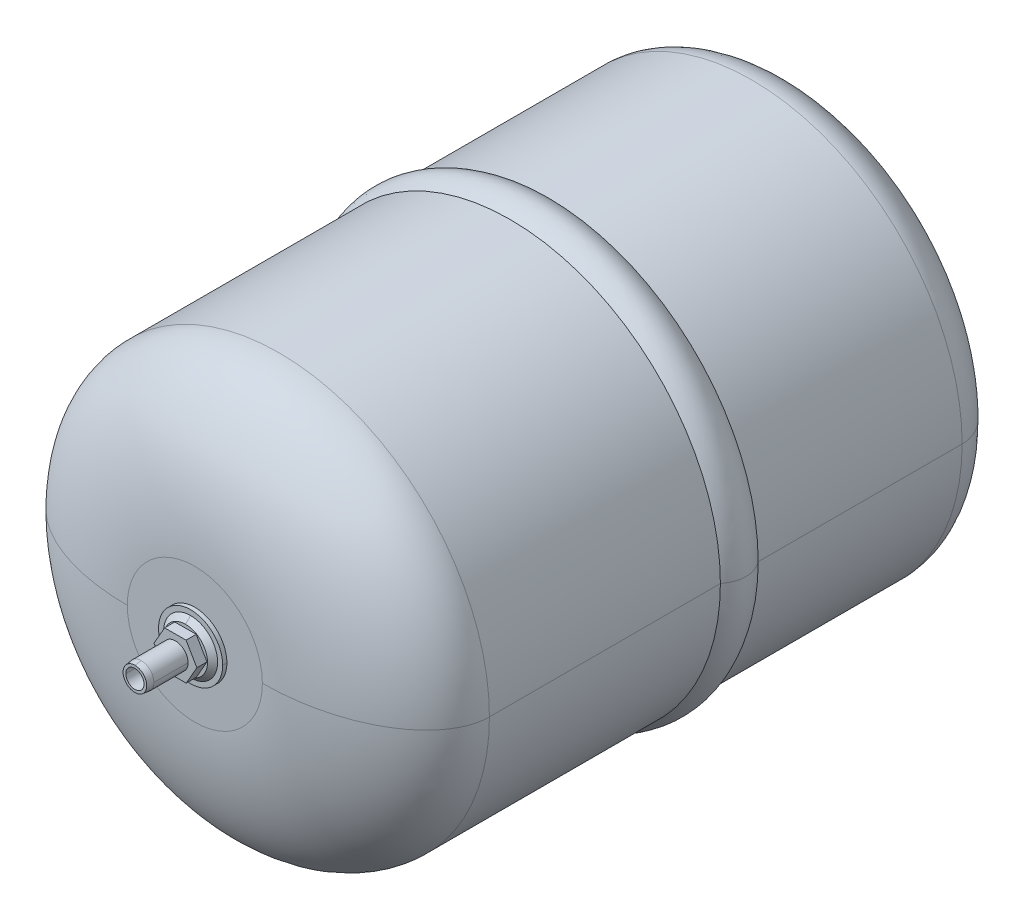
ISO-10303-21;
HEADER;
FILE_DESCRIPTION(('STEP AP214'),'2;1');
FILE_NAME('part.step','',(''),(''),'','','');
FILE_SCHEMA(('AUTOMOTIVE_DESIGN { 1 0 10303 214 1 1 1 1 }'));
ENDSEC;
DATA;
#1=APPLICATION_CONTEXT('core data for automotive mechanical design processes');
#2=APPLICATION_PROTOCOL_DEFINITION('international standard','automotive_design',2000,#1);
#3=PRODUCT_CONTEXT('',#1,'mechanical');
#4=PRODUCT('Part','Part','',(#3));
#5=PRODUCT_RELATED_PRODUCT_CATEGORY('part','',(#4));
#6=PRODUCT_DEFINITION_FORMATION('','',#4);
#7=PRODUCT_DEFINITION_CONTEXT('part definition',#1,'design');
#8=PRODUCT_DEFINITION('design','',#6,#7);
#9=PRODUCT_DEFINITION_SHAPE('','',#8);
#10=(LENGTH_UNIT() NAMED_UNIT(*) SI_UNIT(.MILLI.,.METRE.));
#11=(NAMED_UNIT(*) PLANE_ANGLE_UNIT() SI_UNIT($,.RADIAN.));
#12=(NAMED_UNIT(*) SI_UNIT($,.STERADIAN.) SOLID_ANGLE_UNIT());
#13=UNCERTAINTY_MEASURE_WITH_UNIT(LENGTH_MEASURE(1.E-05),#10,'distance_accuracy_value','');
#14=(GEOMETRIC_REPRESENTATION_CONTEXT(3) GLOBAL_UNCERTAINTY_ASSIGNED_CONTEXT((#13)) GLOBAL_UNIT_ASSIGNED_CONTEXT((#10,
#11,#12)) REPRESENTATION_CONTEXT('',''));
#15=CARTESIAN_POINT('',(0.,0.,0.));
#16=DIRECTION('',(0.,0.,1.));
#17=DIRECTION('',(1.,0.,0.));
#18=AXIS2_PLACEMENT_3D('',#15,#16,#17);
#19=CARTESIAN_POINT('',(146.227750069882,64.5053159670911,106.890113648807));
#20=CARTESIAN_POINT('',(146.227750069882,64.5053159670911,113.420210522901));
#21=CARTESIAN_POINT('',(154.978011575014,64.5053159670911,126.712444119144));
#22=CARTESIAN_POINT('',(177.441886352664,64.505315967091,131.890113648807));
#23=CARTESIAN_POINT('',(188.477750069882,64.505315967091,131.890113648807));
#24=(BOUNDED_CURVE() B_SPLINE_CURVE(3,(#19,#20,#21,#22,#23),.UNSPECIFIED.,.F.,
.F.) B_SPLINE_CURVE_WITH_KNOTS((4,1,4),(0.371184601024353,0.785398163397448,1.19961172577054),
.UNSPECIFIED.) CURVE() GEOMETRIC_REPRESENTATION_ITEM() RATIONAL_B_SPLINE_CURVE((1.17157287525381,
1.05719095841794,0.942809041582063,1.05719095841794,1.17157287525381)) REPRESENTATION_ITEM(''));
#25=CARTESIAN_POINT('',(208.477750069882,64.5053159670909,106.890113648807));
#26=DIRECTION('',(0.,0.,-1.));
#27=AXIS1_PLACEMENT('',#25,#26);
#28=SURFACE_OF_REVOLUTION('',#24,#27);
#29=CARTESIAN_POINT('',(188.477750069882,64.505315967091,106.890113648807));
#30=DIRECTION('',(0.,-1.,0.));
#31=DIRECTION('',(-1.,0.,0.));
#32=AXIS2_PLACEMENT_3D('',#29,#30,#31);
#33=ELLIPSE('',#32,42.25,25.);
#34=CARTESIAN_POINT('',(188.477750069882,64.505315967091,131.890113648807));
#35=VERTEX_POINT('',#34);
#36=CARTESIAN_POINT('',(146.227750069882,64.5053159670909,106.890113648807));
#37=VERTEX_POINT('',#36);
#38=EDGE_CURVE('E65',#35,#37,#33,.T.);
#39=ORIENTED_EDGE('',*,*,#38,.F.);
#40=CARTESIAN_POINT('',(208.477750069882,64.5053159670909,131.890113648807));
#41=DIRECTION('',(0.,0.,-1.));
#42=DIRECTION('',(-1.,0.,0.));
#43=AXIS2_PLACEMENT_3D('',#40,#41,#42);
#44=CIRCLE('',#43,20.);
#45=CARTESIAN_POINT('',(228.477750069882,64.5053159670909,131.890113648807));
#46=VERTEX_POINT('',#45);
#47=EDGE_CURVE('E11',#35,#46,#44,.T.);
#48=ORIENTED_EDGE('',*,*,#47,.T.);
#49=CARTESIAN_POINT('',(228.477750069882,64.5053159670909,106.890113648807));
#50=DIRECTION('',(0.,1.,0.));
#51=DIRECTION('',(1.,0.,0.));
#52=AXIS2_PLACEMENT_3D('',#49,#50,#51);
#53=ELLIPSE('',#52,42.25,25.);
#54=CARTESIAN_POINT('',(270.727750069882,64.5053159670909,106.890113648807));
#55=VERTEX_POINT('',#54);
#56=EDGE_CURVE('E57',#46,#55,#53,.T.);
#57=ORIENTED_EDGE('',*,*,#56,.T.);
#58=CARTESIAN_POINT('',(208.477750069882,64.5053159670909,106.890113648807));
#59=DIRECTION('',(0.,0.,-1.));
#60=DIRECTION('',(1.,0.,0.));
#61=AXIS2_PLACEMENT_3D('',#58,#59,#60);
#62=CIRCLE('',#61,62.25);
#63=EDGE_CURVE('E236',#37,#55,#62,.T.);
#64=ORIENTED_EDGE('',*,*,#63,.F.);
#65=EDGE_LOOP('',(#39,#48,#57,#64));
#66=FACE_BOUND('',#65,.T.);
#67=ADVANCED_FACE('F44',(#66),#28,.F.);
#68=CARTESIAN_POINT('',(146.227750069882,64.5053159670911,-33.1098863511925));
#69=CARTESIAN_POINT('',(146.227750069882,64.5053159670911,-37.2891483506124));
#70=CARTESIAN_POINT('',(151.353642904249,64.5053159670911,-45.7961778522077));
#71=CARTESIAN_POINT('',(164.512954164529,64.5053159670911,-49.1098863511925));
#72=CARTESIAN_POINT('',(170.977750069882,64.5053159670911,-49.1098863511925));
#73=(BOUNDED_CURVE() B_SPLINE_CURVE(3,(#68,#69,#70,#71,#72),.UNSPECIFIED.,.F.,
.F.) B_SPLINE_CURVE_WITH_KNOTS((4,1,4),(0.371184601024353,0.785398163397448,1.19961172577054),
.UNSPECIFIED.) CURVE() GEOMETRIC_REPRESENTATION_ITEM() RATIONAL_B_SPLINE_CURVE((1.17157287525381,
1.05719095841794,0.942809041582063,1.05719095841794,1.17157287525381)) REPRESENTATION_ITEM(''));
#74=CARTESIAN_POINT('',(208.477750069882,64.5053159670909,-33.1098863511925));
#75=DIRECTION('',(0.,0.,1.));
#76=AXIS1_PLACEMENT('',#74,#75);
#77=SURFACE_OF_REVOLUTION('',#73,#76);
#78=CARTESIAN_POINT('',(170.977750069882,64.5053159670911,-33.1098863511925));
#79=DIRECTION('',(0.,1.,0.));
#80=DIRECTION('',(-1.,0.,0.));
#81=AXIS2_PLACEMENT_3D('',#78,#79,#80);
#82=ELLIPSE('',#81,24.75,16.);
#83=CARTESIAN_POINT('',(170.977750069882,64.5053159670911,-49.1098863511925));
#84=VERTEX_POINT('',#83);
#85=CARTESIAN_POINT('',(146.227750069882,64.5053159670909,-33.1098863511925));
#86=VERTEX_POINT('',#85);
#87=EDGE_CURVE('E208',#84,#86,#82,.T.);
#88=ORIENTED_EDGE('',*,*,#87,.F.);
#89=CARTESIAN_POINT('',(208.477750069882,64.5053159670909,-49.1098863511925));
#90=DIRECTION('',(0.,0.,1.));
#91=DIRECTION('',(-1.,0.,0.));
#92=AXIS2_PLACEMENT_3D('',#89,#90,#91);
#93=CIRCLE('',#92,37.5);
#94=CARTESIAN_POINT('',(245.977750069882,64.5053159670908,-49.1098863511925));
#95=VERTEX_POINT('',#94);
#96=EDGE_CURVE('E260',#84,#95,#93,.T.);
#97=ORIENTED_EDGE('',*,*,#96,.T.);
#98=CARTESIAN_POINT('',(245.977750069882,64.5053159670908,-33.1098863511925));
#99=DIRECTION('',(0.,-1.,0.));
#100=DIRECTION('',(1.,0.,0.));
#101=AXIS2_PLACEMENT_3D('',#98,#99,#100);
#102=ELLIPSE('',#101,24.75,16.);
#103=CARTESIAN_POINT('',(270.727750069882,64.5053159670909,-33.1098863511925));
#104=VERTEX_POINT('',#103);
#105=EDGE_CURVE('E222',#95,#104,#102,.T.);
#106=ORIENTED_EDGE('',*,*,#105,.T.);
#107=CARTESIAN_POINT('',(208.477750069882,64.5053159670909,-33.1098863511925));
#108=DIRECTION('',(0.,0.,1.));
#109=DIRECTION('',(1.,0.,0.));
#110=AXIS2_PLACEMENT_3D('',#107,#108,#109);
#111=CIRCLE('',#110,62.25);
#112=EDGE_CURVE('E218',#86,#104,#111,.T.);
#113=ORIENTED_EDGE('',*,*,#112,.F.);
#114=EDGE_LOOP('',(#88,#97,#106,#113));
#115=FACE_BOUND('',#114,.T.);
#116=ADVANCED_FACE('F221',(#115),#77,.F.);
#117=CARTESIAN_POINT('',(146.227750069882,64.5053159670911,38.4852504260056));
#118=CARTESIAN_POINT('',(144.913464355596,64.5053159670911,36.7267788674577));
#119=CARTESIAN_POINT('',(143.521867716941,64.5053159670911,32.8901136488075));
#120=CARTESIAN_POINT('',(144.913464355596,64.5053159670911,29.0534484301573));
#121=CARTESIAN_POINT('',(146.227750069882,64.5053159670911,27.2949768716093));
#122=(BOUNDED_CURVE() B_SPLINE_CURVE(3,(#117,#118,#119,#120,#121),.UNSPECIFIED.,.F.,
.F.) B_SPLINE_CURVE_WITH_KNOTS((4,1,4),(-6.49169972123666,-6.28318530717959,-6.07467089312251),
.UNSPECIFIED.) CURVE() GEOMETRIC_REPRESENTATION_ITEM() RATIONAL_B_SPLINE_CURVE((1.04347826086956,
1.01449275362319,0.985507246376812,1.01449275362319,1.04347826086956)) REPRESENTATION_ITEM(''));
#123=CARTESIAN_POINT('',(208.477750069882,64.5053159670909,38.4852504260056));
#124=DIRECTION('',(0.,0.,1.));
#125=AXIS1_PLACEMENT('',#123,#124);
#126=SURFACE_OF_REVOLUTION('',#122,#125);
#127=CARTESIAN_POINT('',(168.227750069882,64.5053159670911,32.8901136488075));
#128=DIRECTION('',(0.,1.,0.));
#129=DIRECTION('',(-1.,0.,0.));
#130=AXIS2_PLACEMENT_3D('',#127,#128,#129);
#131=ELLIPSE('',#130,24.,14.);
#132=CARTESIAN_POINT('',(146.227750069882,64.5053159670911,27.2949768716093));
#133=VERTEX_POINT('',#132);
#134=CARTESIAN_POINT('',(146.227750069882,64.5053159670911,38.4852504260056));
#135=VERTEX_POINT('',#134);
#136=EDGE_CURVE('E288',#133,#135,#131,.T.);
#137=ORIENTED_EDGE('',*,*,#136,.F.);
#138=CARTESIAN_POINT('',(208.477750069882,64.5053159670909,27.2949768716093));
#139=DIRECTION('',(0.,0.,-1.));
#140=DIRECTION('',(-1.,0.,0.));
#141=AXIS2_PLACEMENT_3D('',#138,#139,#140);
#142=CIRCLE('',#141,62.25);
#143=CARTESIAN_POINT('',(270.727750069882,64.5053159670909,27.2949768716093));
#144=VERTEX_POINT('',#143);
#145=EDGE_CURVE('E240',#144,#133,#142,.T.);
#146=ORIENTED_EDGE('',*,*,#145,.F.);
#147=CARTESIAN_POINT('',(248.727750069882,64.5053159670908,32.8901136488075));
#148=DIRECTION('',(0.,-1.,0.));
#149=DIRECTION('',(1.,0.,0.));
#150=AXIS2_PLACEMENT_3D('',#147,#148,#149);
#151=ELLIPSE('',#150,24.,14.);
#152=CARTESIAN_POINT('',(270.727750069882,64.5053159670909,38.4852504260056));
#153=VERTEX_POINT('',#152);
#154=EDGE_CURVE('E261',#144,#153,#151,.T.);
#155=ORIENTED_EDGE('',*,*,#154,.T.);
#156=CARTESIAN_POINT('',(208.477750069882,64.5053159670909,38.4852504260056));
#157=DIRECTION('',(0.,0.,1.));
#158=DIRECTION('',(-1.,0.,0.));
#159=AXIS2_PLACEMENT_3D('',#156,#157,#158);
#160=CIRCLE('',#159,62.25);
#161=EDGE_CURVE('E247',#135,#153,#160,.T.);
#162=ORIENTED_EDGE('',*,*,#161,.F.);
#163=EDGE_LOOP('',(#137,#146,#155,#162));
#164=FACE_BOUND('',#163,.T.);
#165=ADVANCED_FACE('F412',(#164),#126,.F.);
#166=CARTESIAN_POINT('',(208.477750069882,64.5053159670909,36.8901136488075));
#167=DIRECTION('',(0.,0.,1.));
#168=DIRECTION('',(1.,0.,0.));
#169=AXIS2_PLACEMENT_3D('',#166,#167,#168);
#170=CYLINDRICAL_SURFACE('',#169,62.25);
#171=DIRECTION('',(0.,0.,1.));
#172=VECTOR('',#171,1.);
#173=CARTESIAN_POINT('',(270.727750069882,64.5053159670909,72.6876820374066));
#174=LINE('',#173,#172);
#175=EDGE_CURVE('E358',#153,#55,#174,.T.);
#176=ORIENTED_EDGE('',*,*,#175,.F.);
#177=CARTESIAN_POINT('',(208.477750069882,64.5053159670909,38.4852504260056));
#178=DIRECTION('',(0.,0.,1.));
#179=DIRECTION('',(-1.,0.,0.));
#180=AXIS2_PLACEMENT_3D('',#177,#178,#179);
#181=CIRCLE('',#180,62.25);
#182=EDGE_CURVE('E281',#153,#135,#181,.T.);
#183=ORIENTED_EDGE('',*,*,#182,.T.);
#184=DIRECTION('',(0.,0.,-1.));
#185=VECTOR('',#184,1.);
#186=CARTESIAN_POINT('',(146.227750069882,64.5053159670909,72.6876820374066));
#187=LINE('',#186,#185);
#188=EDGE_CURVE('E359',#37,#135,#187,.T.);
#189=ORIENTED_EDGE('',*,*,#188,.F.);
#190=ORIENTED_EDGE('',*,*,#63,.T.);
#191=EDGE_LOOP('',(#176,#183,#189,#190));
#192=FACE_BOUND('',#191,.T.);
#193=ADVANCED_FACE('F415',(#192),#170,.T.);
#194=CARTESIAN_POINT('',(208.477750069882,64.5053159670909,36.8901136488075));
#195=DIRECTION('',(0.,0.,1.));
#196=DIRECTION('',(1.,0.,0.));
#197=AXIS2_PLACEMENT_3D('',#194,#195,#196);
#198=CYLINDRICAL_SURFACE('',#197,62.25);
#199=DIRECTION('',(0.,0.,1.));
#200=VECTOR('',#199,1.);
#201=CARTESIAN_POINT('',(270.727750069882,64.5053159670909,-2.90745473979162));
#202=LINE('',#201,#200);
#203=EDGE_CURVE('E234',#104,#144,#202,.T.);
#204=ORIENTED_EDGE('',*,*,#203,.F.);
#205=CARTESIAN_POINT('',(208.477750069882,64.5053159670909,-33.1098863511925));
#206=DIRECTION('',(0.,0.,1.));
#207=DIRECTION('',(1.,0.,0.));
#208=AXIS2_PLACEMENT_3D('',#205,#206,#207);
#209=CIRCLE('',#208,62.25);
#210=EDGE_CURVE('E212',#104,#86,#209,.T.);
#211=ORIENTED_EDGE('',*,*,#210,.T.);
#212=DIRECTION('',(0.,0.,-1.));
#213=VECTOR('',#212,1.);
#214=CARTESIAN_POINT('',(146.227750069882,64.5053159670909,-2.90745473979162));
#215=LINE('',#214,#213);
#216=EDGE_CURVE('E228',#133,#86,#215,.T.);
#217=ORIENTED_EDGE('',*,*,#216,.F.);
#218=CARTESIAN_POINT('',(208.477750069882,64.5053159670909,27.2949768716093));
#219=DIRECTION('',(0.,0.,-1.));
#220=DIRECTION('',(-1.,0.,0.));
#221=AXIS2_PLACEMENT_3D('',#218,#219,#220);
#222=CIRCLE('',#221,62.25);
#223=EDGE_CURVE('E237',#133,#144,#222,.T.);
#224=ORIENTED_EDGE('',*,*,#223,.T.);
#225=EDGE_LOOP('',(#204,#211,#217,#224));
#226=FACE_BOUND('',#225,.T.);
#227=ADVANCED_FACE('F231',(#226),#198,.T.);
#228=CARTESIAN_POINT('',(208.477750069882,64.5053159670909,131.890113648807));
#229=DIRECTION('',(0.,0.,1.));
#230=DIRECTION('',(1.,0.,0.));
#231=AXIS2_PLACEMENT_3D('',#228,#229,#230);
#232=CYLINDRICAL_SURFACE('',#231,9.5);
#233=DIRECTION('',(0.,0.,-1.));
#234=VECTOR('',#233,1.);
#235=CARTESIAN_POINT('',(198.977750069882,64.5053159670909,131.890113648807));
#236=LINE('',#235,#234);
#237=CARTESIAN_POINT('',(198.977750069882,64.5053159670909,133.140113648807));
#238=VERTEX_POINT('',#237);
#239=CARTESIAN_POINT('',(198.977750069882,64.5053159670909,131.890113648807));
#240=VERTEX_POINT('',#239);
#241=EDGE_CURVE('E324',#238,#240,#236,.T.);
#242=ORIENTED_EDGE('',*,*,#241,.F.);
#243=CARTESIAN_POINT('',(208.477750069882,64.5053159670909,133.140113648807));
#244=DIRECTION('',(0.,0.,1.));
#245=DIRECTION('',(1.,0.,0.));
#246=AXIS2_PLACEMENT_3D('',#243,#244,#245);
#247=CIRCLE('',#246,9.5);
#248=CARTESIAN_POINT('',(217.977750069882,64.5053159670909,133.140113648807));
#249=VERTEX_POINT('',#248);
#250=EDGE_CURVE('E315',#249,#238,#247,.T.);
#251=ORIENTED_EDGE('',*,*,#250,.F.);
#252=DIRECTION('',(0.,0.,1.));
#253=VECTOR('',#252,1.);
#254=CARTESIAN_POINT('',(217.977750069882,64.5053159670909,131.890113648807));
#255=LINE('',#254,#253);
#256=CARTESIAN_POINT('',(217.977750069882,64.5053159670909,131.890113648807));
#257=VERTEX_POINT('',#256);
#258=EDGE_CURVE('E284',#257,#249,#255,.T.);
#259=ORIENTED_EDGE('',*,*,#258,.F.);
#260=CARTESIAN_POINT('',(208.477750069882,64.5053159670909,131.890113648807));
#261=DIRECTION('',(0.,0.,1.));
#262=DIRECTION('',(1.,0.,0.));
#263=AXIS2_PLACEMENT_3D('',#260,#261,#262);
#264=CIRCLE('',#263,9.5);
#265=EDGE_CURVE('E302',#257,#240,#264,.T.);
#266=ORIENTED_EDGE('',*,*,#265,.T.);
#267=EDGE_LOOP('',(#242,#251,#259,#266));
#268=FACE_BOUND('',#267,.T.);
#269=ADVANCED_FACE('F556',(#268),#232,.T.);
#270=CARTESIAN_POINT('',(208.477750069882,64.5053159670909,133.890113648807));
#271=DIRECTION('',(0.,0.,-1.));
#272=DIRECTION('',(0.,-1.,0.));
#273=AXIS2_PLACEMENT_3D('',#270,#271,#272);
#274=CONICAL_SURFACE('',#273,7.25,0.785398163397444);
#275=DIRECTION('',(0.,0.707106781186545,0.70710678118655));
#276=VECTOR('',#275,1.);
#277=CARTESIAN_POINT('',(208.477750069882,57.2553159670909,133.890113648807));
#278=LINE('',#277,#276);
#279=CARTESIAN_POINT('',(208.477750069882,56.5053159670909,133.140113648807));
#280=VERTEX_POINT('',#279);
#281=CARTESIAN_POINT('',(208.477750069882,58.0053159670909,134.640113648807));
#282=VERTEX_POINT('',#281);
#283=EDGE_CURVE('E262',#280,#282,#278,.T.);
#284=ORIENTED_EDGE('',*,*,#283,.F.);
#285=CARTESIAN_POINT('',(208.477750069882,64.5053159670909,133.140113648807));
#286=DIRECTION('',(0.,0.,-1.));
#287=DIRECTION('',(0.,-1.,0.));
#288=AXIS2_PLACEMENT_3D('',#285,#286,#287);
#289=CIRCLE('',#288,8.);
#290=CARTESIAN_POINT('',(208.477750069882,72.5053159670909,133.140113648807));
#291=VERTEX_POINT('',#290);
#292=EDGE_CURVE('E347',#291,#280,#289,.T.);
#293=ORIENTED_EDGE('',*,*,#292,.F.);
#294=DIRECTION('',(0.,0.707106781186545,-0.70710678118655));
#295=VECTOR('',#294,1.);
#296=CARTESIAN_POINT('',(208.477750069882,71.7553159670909,133.890113648807));
#297=LINE('',#296,#295);
#298=CARTESIAN_POINT('',(208.477750069882,71.0053159670909,134.640113648807));
#299=VERTEX_POINT('',#298);
#300=EDGE_CURVE('E265',#299,#291,#297,.T.);
#301=ORIENTED_EDGE('',*,*,#300,.F.);
#302=CARTESIAN_POINT('',(208.477750069882,64.5053159670909,134.640113648807));
#303=DIRECTION('',(0.,0.,1.));
#304=DIRECTION('',(0.,-1.,0.));
#305=AXIS2_PLACEMENT_3D('',#302,#303,#304);
#306=CIRCLE('',#305,6.5);
#307=EDGE_CURVE('E258',#282,#299,#306,.T.);
#308=ORIENTED_EDGE('',*,*,#307,.F.);
#309=EDGE_LOOP('',(#284,#293,#301,#308));
#310=FACE_BOUND('',#309,.T.);
#311=ADVANCED_FACE('F553',(#310),#274,.T.);
#312=CARTESIAN_POINT('',(208.477750069882,64.5053159670909,137.640113648807));
#313=DIRECTION('',(0.,0.,1.));
#314=DIRECTION('',(1.,0.,0.));
#315=AXIS2_PLACEMENT_3D('',#312,#313,#314);
#316=CYLINDRICAL_SURFACE('',#315,3.75);
#317=DIRECTION('',(0.,0.,-1.));
#318=VECTOR('',#317,1.);
#319=CARTESIAN_POINT('',(204.727750069882,64.5053159670909,137.640113648807));
#320=LINE('',#319,#318);
#321=CARTESIAN_POINT('',(204.727750069882,64.5053159670909,147.765113648807));
#322=VERTEX_POINT('',#321);
#323=CARTESIAN_POINT('',(204.727750069882,64.5053159670909,137.640113648807));
#324=VERTEX_POINT('',#323);
#325=EDGE_CURVE('E320',#322,#324,#320,.T.);
#326=ORIENTED_EDGE('',*,*,#325,.F.);
#327=CARTESIAN_POINT('',(208.477750069882,64.5053159670909,147.765113648807));
#328=DIRECTION('',(0.,0.,-1.));
#329=DIRECTION('',(1.,0.,0.));
#330=AXIS2_PLACEMENT_3D('',#327,#328,#329);
#331=CIRCLE('',#330,3.75);
#332=CARTESIAN_POINT('',(208.477750069882,68.2553159670909,147.765113648807));
#333=VERTEX_POINT('',#332);
#334=EDGE_CURVE('E276',#322,#333,#331,.T.);
#335=ORIENTED_EDGE('',*,*,#334,.T.);
#336=CARTESIAN_POINT('',(208.477750069882,64.5053159670909,147.765113648807));
#337=DIRECTION('',(0.,0.,-1.));
#338=DIRECTION('',(1.,0.,0.));
#339=AXIS2_PLACEMENT_3D('',#336,#337,#338);
#340=CIRCLE('',#339,3.75);
#341=CARTESIAN_POINT('',(212.227750069882,64.5053159670909,147.765113648807));
#342=VERTEX_POINT('',#341);
#343=EDGE_CURVE('E272',#333,#342,#340,.T.);
#344=ORIENTED_EDGE('',*,*,#343,.T.);
#345=DIRECTION('',(0.,0.,1.));
#346=VECTOR('',#345,1.);
#347=CARTESIAN_POINT('',(212.227750069882,64.5053159670909,137.640113648807));
#348=LINE('',#347,#346);
#349=CARTESIAN_POINT('',(212.227750069882,64.5053159670909,137.640113648807));
#350=VERTEX_POINT('',#349);
#351=EDGE_CURVE('E253',#350,#342,#348,.T.);
#352=ORIENTED_EDGE('',*,*,#351,.F.);
#353=CARTESIAN_POINT('',(208.477750069882,64.5053159670909,137.640113648807));
#354=DIRECTION('',(0.,0.,1.));
#355=DIRECTION('',(1.,0.,0.));
#356=AXIS2_PLACEMENT_3D('',#353,#354,#355);
#357=CIRCLE('',#356,3.75);
#358=EDGE_CURVE('E277',#350,#324,#357,.T.);
#359=ORIENTED_EDGE('',*,*,#358,.T.);
#360=EDGE_LOOP('',(#326,#335,#344,#352,#359));
#361=FACE_BOUND('',#360,.T.);
#362=ADVANCED_FACE('F555',(#361),#316,.T.);
#363=CARTESIAN_POINT('',(208.477750069882,64.5053159670909,149.640113648807));
#364=DIRECTION('',(0.,0.,1.));
#365=DIRECTION('',(1.,0.,0.));
#366=AXIS2_PLACEMENT_3D('',#363,#364,#365);
#367=CYLINDRICAL_SURFACE('',#366,2.7);
#368=DIRECTION('',(0.,0.,-1.));
#369=VECTOR('',#368,1.);
#370=CARTESIAN_POINT('',(205.777750069882,64.5053159670909,149.640113648807));
#371=LINE('',#370,#369);
#372=CARTESIAN_POINT('',(205.777750069882,64.5053159670909,149.640113648807));
#373=VERTEX_POINT('',#372);
#374=CARTESIAN_POINT('',(205.777750069882,64.5053159670909,119.640113648807));
#375=VERTEX_POINT('',#374);
#376=EDGE_CURVE('E353',#373,#375,#371,.T.);
#377=ORIENTED_EDGE('',*,*,#376,.F.);
#378=CARTESIAN_POINT('',(208.477750069882,64.5053159670909,149.640113648807));
#379=DIRECTION('',(0.,0.,1.));
#380=DIRECTION('',(1.,0.,0.));
#381=AXIS2_PLACEMENT_3D('',#378,#379,#380);
#382=CIRCLE('',#381,2.7);
#383=CARTESIAN_POINT('',(211.177750069882,64.5053159670909,149.640113648807));
#384=VERTEX_POINT('',#383);
#385=EDGE_CURVE('E376',#373,#384,#382,.T.);
#386=ORIENTED_EDGE('',*,*,#385,.T.);
#387=DIRECTION('',(0.,0.,1.));
#388=VECTOR('',#387,1.);
#389=CARTESIAN_POINT('',(211.177750069882,64.5053159670909,149.640113648807));
#390=LINE('',#389,#388);
#391=CARTESIAN_POINT('',(211.177750069882,64.5053159670909,119.640113648807));
#392=VERTEX_POINT('',#391);
#393=EDGE_CURVE('E377',#392,#384,#390,.T.);
#394=ORIENTED_EDGE('',*,*,#393,.F.);
#395=CARTESIAN_POINT('',(208.477750069882,64.5053159670909,119.640113648807));
#396=DIRECTION('',(0.,0.,1.));
#397=DIRECTION('',(1.,0.,0.));
#398=AXIS2_PLACEMENT_3D('',#395,#396,#397);
#399=CIRCLE('',#398,2.7);
#400=EDGE_CURVE('E499',#375,#392,#399,.T.);
#401=ORIENTED_EDGE('',*,*,#400,.F.);
#402=EDGE_LOOP('',(#377,#386,#394,#401));
#403=FACE_BOUND('',#402,.T.);
#404=ADVANCED_FACE('F562',(#403),#367,.F.);
#405=CARTESIAN_POINT('',(208.477750069882,64.5053159670909,148.702613648807));
#406=DIRECTION('',(0.,0.,-1.));
#407=DIRECTION('',(0.,1.,0.));
#408=AXIS2_PLACEMENT_3D('',#405,#406,#407);
#409=CONICAL_SURFACE('',#408,3.625,0.132551532296674);
#410=DIRECTION('',(0.,-0.132163720091018,0.991227900682635));
#411=VECTOR('',#410,1.);
#412=CARTESIAN_POINT('',(208.477750069882,68.1303159670909,148.702613648807));
#413=LINE('',#412,#411);
#414=CARTESIAN_POINT('',(208.477750069882,68.0053159670909,149.640113648807));
#415=VERTEX_POINT('',#414);
#416=EDGE_CURVE('E352',#333,#415,#413,.T.);
#417=ORIENTED_EDGE('',*,*,#416,.F.);
#418=ORIENTED_EDGE('',*,*,#334,.F.);
#419=CARTESIAN_POINT('',(208.477750069882,64.5053159670909,147.765113648807));
#420=DIRECTION('',(0.,0.,-1.));
#421=DIRECTION('',(1.,0.,0.));
#422=AXIS2_PLACEMENT_3D('',#419,#420,#421);
#423=CIRCLE('',#422,3.75);
#424=CARTESIAN_POINT('',(208.477750069882,60.7553159670909,147.765113648807));
#425=VERTEX_POINT('',#424);
#426=EDGE_CURVE('E254',#425,#322,#423,.T.);
#427=ORIENTED_EDGE('',*,*,#426,.F.);
#428=DIRECTION('',(0.,-0.132163720091018,-0.991227900682635));
#429=VECTOR('',#428,1.);
#430=CARTESIAN_POINT('',(208.477750069882,60.8803159670909,148.702613648807));
#431=LINE('',#430,#429);
#432=CARTESIAN_POINT('',(208.477750069882,61.0053159670909,149.640113648807));
#433=VERTEX_POINT('',#432);
#434=EDGE_CURVE('E349',#433,#425,#431,.T.);
#435=ORIENTED_EDGE('',*,*,#434,.F.);
#436=CARTESIAN_POINT('',(208.477750069882,64.5053159670909,149.640113648807));
#437=DIRECTION('',(0.,0.,1.));
#438=DIRECTION('',(0.,1.,0.));
#439=AXIS2_PLACEMENT_3D('',#436,#437,#438);
#440=CIRCLE('',#439,3.5);
#441=EDGE_CURVE('E328',#415,#433,#440,.T.);
#442=ORIENTED_EDGE('',*,*,#441,.F.);
#443=EDGE_LOOP('',(#417,#418,#427,#435,#442));
#444=FACE_BOUND('',#443,.T.);
#445=ADVANCED_FACE('F577',(#444),#409,.T.);
#446=CARTESIAN_POINT('',(189.727750069882,64.505315967091,-49.1098863511925));
#447=DIRECTION('',(0.,0.,-1.));
#448=DIRECTION('',(0.,-1.,0.));
#449=AXIS2_PLACEMENT_3D('',#446,#447,#448);
#450=PLANE('',#449);
#451=ORIENTED_EDGE('',*,*,#96,.F.);
#452=CARTESIAN_POINT('',(208.477750069882,64.5053159670909,-49.1098863511925));
#453=DIRECTION('',(0.,0.,1.));
#454=DIRECTION('',(-1.,0.,0.));
#455=AXIS2_PLACEMENT_3D('',#452,#453,#454);
#456=CIRCLE('',#455,37.5);
#457=EDGE_CURVE('E214',#95,#84,#456,.T.);
#458=ORIENTED_EDGE('',*,*,#457,.F.);
#459=EDGE_LOOP('',(#451,#458));
#460=FACE_BOUND('',#459,.T.);
#461=ADVANCED_FACE('F571',(#460),#450,.T.);
#462=CARTESIAN_POINT('',(208.477750069882,64.5053159670909,148.702613648807));
#463=DIRECTION('',(0.,0.,-1.));
#464=DIRECTION('',(0.,1.,0.));
#465=AXIS2_PLACEMENT_3D('',#462,#463,#464);
#466=CONICAL_SURFACE('',#465,3.625,0.132551532296674);
#467=ORIENTED_EDGE('',*,*,#416,.T.);
#468=CARTESIAN_POINT('',(208.477750069882,64.5053159670909,149.640113648807));
#469=DIRECTION('',(0.,0.,1.));
#470=DIRECTION('',(0.,1.,0.));
#471=AXIS2_PLACEMENT_3D('',#468,#469,#470);
#472=CIRCLE('',#471,3.5);
#473=EDGE_CURVE('E325',#433,#415,#472,.T.);
#474=ORIENTED_EDGE('',*,*,#473,.F.);
#475=ORIENTED_EDGE('',*,*,#434,.T.);
#476=CARTESIAN_POINT('',(208.477750069882,64.5053159670909,147.765113648807));
#477=DIRECTION('',(0.,0.,-1.));
#478=DIRECTION('',(1.,0.,0.));
#479=AXIS2_PLACEMENT_3D('',#476,#477,#478);
#480=CIRCLE('',#479,3.75);
#481=EDGE_CURVE('E249',#342,#425,#480,.T.);
#482=ORIENTED_EDGE('',*,*,#481,.F.);
#483=ORIENTED_EDGE('',*,*,#343,.F.);
#484=EDGE_LOOP('',(#467,#474,#475,#482,#483));
#485=FACE_BOUND('',#484,.T.);
#486=ADVANCED_FACE('F567',(#485),#466,.T.);
#487=CARTESIAN_POINT('',(208.477750069882,64.5053159670909,149.640113648807));
#488=DIRECTION('',(0.,0.,1.));
#489=DIRECTION('',(1.,0.,0.));
#490=AXIS2_PLACEMENT_3D('',#487,#488,#489);
#491=CYLINDRICAL_SURFACE('',#490,2.7);
#492=ORIENTED_EDGE('',*,*,#376,.T.);
#493=CARTESIAN_POINT('',(208.477750069882,64.5053159670909,119.640113648807));
#494=DIRECTION('',(0.,0.,1.));
#495=DIRECTION('',(1.,0.,0.));
#496=AXIS2_PLACEMENT_3D('',#493,#494,#495);
#497=CIRCLE('',#496,2.7);
#498=EDGE_CURVE('E506',#392,#375,#497,.T.);
#499=ORIENTED_EDGE('',*,*,#498,.F.);
#500=ORIENTED_EDGE('',*,*,#393,.T.);
#501=CARTESIAN_POINT('',(208.477750069882,64.5053159670909,149.640113648807));
#502=DIRECTION('',(0.,0.,1.));
#503=DIRECTION('',(1.,0.,0.));
#504=AXIS2_PLACEMENT_3D('',#501,#502,#503);
#505=CIRCLE('',#504,2.7);
#506=EDGE_CURVE('E379',#384,#373,#505,.T.);
#507=ORIENTED_EDGE('',*,*,#506,.T.);
#508=EDGE_LOOP('',(#492,#499,#500,#507));
#509=FACE_BOUND('',#508,.T.);
#510=ADVANCED_FACE('F570',(#509),#491,.F.);
#511=CARTESIAN_POINT('',(208.477750069882,61.2553159670909,149.640113648807));
#512=DIRECTION('',(0.,0.,1.));
#513=DIRECTION('',(1.,0.,0.));
#514=AXIS2_PLACEMENT_3D('',#511,#512,#513);
#515=PLANE('',#514);
#516=ORIENTED_EDGE('',*,*,#441,.T.);
#517=ORIENTED_EDGE('',*,*,#473,.T.);
#518=EDGE_LOOP('',(#516,#517));
#519=FACE_BOUND('',#518,.T.);
#520=ORIENTED_EDGE('',*,*,#506,.F.);
#521=ORIENTED_EDGE('',*,*,#385,.F.);
#522=EDGE_LOOP('',(#520,#521));
#523=FACE_BOUND('',#522,.T.);
#524=ADVANCED_FACE('F452',(#519,#523),#515,.T.);
#525=CARTESIAN_POINT('',(208.477750069882,64.5053159670909,137.640113648807));
#526=DIRECTION('',(0.,0.,1.));
#527=DIRECTION('',(1.,0.,0.));
#528=AXIS2_PLACEMENT_3D('',#525,#526,#527);
#529=CYLINDRICAL_SURFACE('',#528,3.75);
#530=ORIENTED_EDGE('',*,*,#325,.T.);
#531=CARTESIAN_POINT('',(208.477750069882,64.5053159670909,137.640113648807));
#532=DIRECTION('',(0.,0.,1.));
#533=DIRECTION('',(1.,0.,0.));
#534=AXIS2_PLACEMENT_3D('',#531,#532,#533);
#535=CIRCLE('',#534,3.75);
#536=EDGE_CURVE('E316',#324,#350,#535,.T.);
#537=ORIENTED_EDGE('',*,*,#536,.T.);
#538=ORIENTED_EDGE('',*,*,#351,.T.);
#539=ORIENTED_EDGE('',*,*,#481,.T.);
#540=ORIENTED_EDGE('',*,*,#426,.T.);
#541=EDGE_LOOP('',(#530,#537,#538,#539,#540));
#542=FACE_BOUND('',#541,.T.);
#543=ADVANCED_FACE('F596',(#542),#529,.T.);
#544=CARTESIAN_POINT('',(208.477750069882,61.2553159670909,137.640113648807));
#545=DIRECTION('',(0.,0.,1.));
#546=DIRECTION('',(1.,0.,0.));
#547=AXIS2_PLACEMENT_3D('',#544,#545,#546);
#548=PLANE('',#547);
#549=DIRECTION('',(0.495688138837588,0.868500586652495,0.));
#550=VECTOR('',#549,1.);
#551=CARTESIAN_POINT('',(212.554931957483,60.5533046413336,137.640113648807));
#552=LINE('',#551,#550);
#553=CARTESIAN_POINT('',(211.680482054315,59.0211714422608,137.640113648807));
#554=VERTEX_POINT('',#553);
#555=CARTESIAN_POINT('',(214.828524538627,64.5368909647076,137.640113648807));
#556=VERTEX_POINT('',#555);
#557=EDGE_CURVE('E298',#554,#556,#552,.T.);
#558=ORIENTED_EDGE('',*,*,#557,.T.);
#559=DIRECTION('',(-0.504299501823955,0.863528813914227,0.));
#560=VECTOR('',#559,1.);
#561=CARTESIAN_POINT('',(213.934808916245,66.067229956875,137.640113648807));
#562=LINE('',#561,#560);
#563=CARTESIAN_POINT('',(211.625792554194,70.0210354895378,137.640113648807));
#564=VERTEX_POINT('',#563);
#565=EDGE_CURVE('E294',#556,#564,#562,.T.);
#566=ORIENTED_EDGE('',*,*,#565,.T.);
#567=DIRECTION('',(-0.999987640661543,-0.00497177273826868,0.));
#568=VECTOR('',#567,1.);
#569=CARTESIAN_POINT('',(208.442326288975,70.0052078231277,137.640113648807));
#570=LINE('',#569,#568);
#571=CARTESIAN_POINT('',(205.275018085449,69.9894604919211,137.640113648807));
#572=VERTEX_POINT('',#571);
#573=EDGE_CURVE('E299',#564,#572,#570,.T.);
#574=ORIENTED_EDGE('',*,*,#573,.T.);
#575=DIRECTION('',(-0.495688138837588,-0.868500586652495,0.));
#576=VECTOR('',#575,1.);
#577=CARTESIAN_POINT('',(203.001425504305,66.0058741685471,137.640113648807));
#578=LINE('',#577,#576);
#579=CARTESIAN_POINT('',(202.126975601137,64.4737409694742,137.640113648807));
#580=VERTEX_POINT('',#579);
#581=EDGE_CURVE('E369',#572,#580,#578,.T.);
#582=ORIENTED_EDGE('',*,*,#581,.T.);
#583=DIRECTION('',(0.504299501823955,-0.863528813914227,0.));
#584=VECTOR('',#583,1.);
#585=CARTESIAN_POINT('',(204.435991963189,60.5199354368115,137.640113648807));
#586=LINE('',#585,#584);
#587=CARTESIAN_POINT('',(205.32970758557,58.9895964446441,137.640113648807));
#588=VERTEX_POINT('',#587);
#589=EDGE_CURVE('E366',#580,#588,#586,.T.);
#590=ORIENTED_EDGE('',*,*,#589,.T.);
#591=DIRECTION('',(0.999987640661543,0.004971772738268,0.));
#592=VECTOR('',#591,1.);
#593=CARTESIAN_POINT('',(208.497015789096,59.0053437758507,137.640113648807));
#594=LINE('',#593,#592);
#595=EDGE_CURVE('E270',#588,#554,#594,.T.);
#596=ORIENTED_EDGE('',*,*,#595,.T.);
#597=EDGE_LOOP('',(#558,#566,#574,#582,#590,#596));
#598=FACE_BOUND('',#597,.T.);
#599=ORIENTED_EDGE('',*,*,#358,.F.);
#600=ORIENTED_EDGE('',*,*,#536,.F.);
#601=EDGE_LOOP('',(#599,#600));
#602=FACE_BOUND('',#601,.T.);
#603=ADVANCED_FACE('F470',(#598,#602),#548,.T.);
#604=CARTESIAN_POINT('',(208.505094819943,59.0053839434525,134.640113648807));
#605=DIRECTION('',(0.004971772738268,-0.999987640661543,0.));
#606=DIRECTION('',(0.,0.,-1.));
#607=AXIS2_PLACEMENT_3D('',#604,#605,#606);
#608=PLANE('',#607);
#609=ORIENTED_EDGE('',*,*,#595,.F.);
#610=DIRECTION('',(0.,0.,1.));
#611=VECTOR('',#610,1.);
#612=CARTESIAN_POINT('',(205.32970758557,58.9895964446441,134.640113648807));
#613=LINE('',#612,#611);
#614=CARTESIAN_POINT('',(205.32970758557,58.9895964446441,134.640113648807));
#615=VERTEX_POINT('',#614);
#616=EDGE_CURVE('E292',#615,#588,#613,.T.);
#617=ORIENTED_EDGE('',*,*,#616,.F.);
#618=DIRECTION('',(0.999987640661543,0.004971772738268,0.));
#619=VECTOR('',#618,1.);
#620=CARTESIAN_POINT('',(205.32970758557,58.9895964446441,134.640113648807));
#621=LINE('',#620,#619);
#622=CARTESIAN_POINT('',(211.680482054315,59.0211714422608,134.640113648807));
#623=VERTEX_POINT('',#622);
#624=EDGE_CURVE('E266',#615,#623,#621,.T.);
#625=ORIENTED_EDGE('',*,*,#624,.T.);
#626=DIRECTION('',(0.,0.,1.));
#627=VECTOR('',#626,1.);
#628=CARTESIAN_POINT('',(211.680482054315,59.0211714422608,134.640113648807));
#629=LINE('',#628,#627);
#630=EDGE_CURVE('E271',#623,#554,#629,.T.);
#631=ORIENTED_EDGE('',*,*,#630,.T.);
#632=EDGE_LOOP('',(#609,#617,#625,#631));
#633=FACE_BOUND('',#632,.T.);
#634=ADVANCED_FACE('F462',(#633),#608,.T.);
#635=CARTESIAN_POINT('',(203.728341593354,61.7316687070592,134.640113648807));
#636=DIRECTION('',(-0.863528813914227,-0.504299501823955,0.));
#637=DIRECTION('',(-0.504299501823955,0.863528813914227,0.));
#638=AXIS2_PLACEMENT_3D('',#635,#636,#637);
#639=PLANE('',#638);
#640=ORIENTED_EDGE('',*,*,#589,.F.);
#641=DIRECTION('',(0.,0.,1.));
#642=VECTOR('',#641,1.);
#643=CARTESIAN_POINT('',(202.126975601137,64.4737409694742,134.640113648807));
#644=LINE('',#643,#642);
#645=CARTESIAN_POINT('',(202.126975601137,64.4737409694742,134.640113648807));
#646=VERTEX_POINT('',#645);
#647=EDGE_CURVE('E293',#646,#580,#644,.T.);
#648=ORIENTED_EDGE('',*,*,#647,.F.);
#649=DIRECTION('',(0.504299501823955,-0.863528813914227,0.));
#650=VECTOR('',#649,1.);
#651=CARTESIAN_POINT('',(202.126975601137,64.4737409694742,134.640113648807));
#652=LINE('',#651,#650);
#653=EDGE_CURVE('E342',#646,#615,#652,.T.);
#654=ORIENTED_EDGE('',*,*,#653,.T.);
#655=ORIENTED_EDGE('',*,*,#616,.T.);
#656=EDGE_LOOP('',(#640,#648,#654,#655));
#657=FACE_BOUND('',#656,.T.);
#658=ADVANCED_FACE('F459',(#657),#639,.T.);
#659=CARTESIAN_POINT('',(203.700996843293,67.2316007306977,134.640113648807));
#660=DIRECTION('',(-0.868500586652495,0.495688138837588,0.));
#661=DIRECTION('',(0.,0.,1.));
#662=AXIS2_PLACEMENT_3D('',#659,#660,#661);
#663=PLANE('',#662);
#664=ORIENTED_EDGE('',*,*,#581,.F.);
#665=DIRECTION('',(0.,0.,1.));
#666=VECTOR('',#665,1.);
#667=CARTESIAN_POINT('',(205.275018085449,69.9894604919211,134.640113648807));
#668=LINE('',#667,#666);
#669=CARTESIAN_POINT('',(205.275018085449,69.9894604919211,134.640113648807));
#670=VERTEX_POINT('',#669);
#671=EDGE_CURVE('E151',#670,#572,#668,.T.);
#672=ORIENTED_EDGE('',*,*,#671,.F.);
#673=DIRECTION('',(-0.495688138837588,-0.868500586652495,0.));
#674=VECTOR('',#673,1.);
#675=CARTESIAN_POINT('',(205.275018085449,69.9894604919211,134.640113648807));
#676=LINE('',#675,#674);
#677=EDGE_CURVE('E289',#670,#646,#676,.T.);
#678=ORIENTED_EDGE('',*,*,#677,.T.);
#679=ORIENTED_EDGE('',*,*,#647,.T.);
#680=EDGE_LOOP('',(#664,#672,#678,#679));
#681=FACE_BOUND('',#680,.T.);
#682=ADVANCED_FACE('F461',(#681),#663,.T.);
#683=CARTESIAN_POINT('',(208.450405319821,70.0052479907294,134.640113648807));
#684=DIRECTION('',(-0.00497177273826868,0.999987640661543,0.));
#685=DIRECTION('',(0.,0.,1.));
#686=AXIS2_PLACEMENT_3D('',#683,#684,#685);
#687=PLANE('',#686);
#688=ORIENTED_EDGE('',*,*,#573,.F.);
#689=DIRECTION('',(0.,0.,1.));
#690=VECTOR('',#689,1.);
#691=CARTESIAN_POINT('',(211.625792554194,70.0210354895378,134.640113648807));
#692=LINE('',#691,#690);
#693=CARTESIAN_POINT('',(211.625792554194,70.0210354895378,134.640113648807));
#694=VERTEX_POINT('',#693);
#695=EDGE_CURVE('E142',#694,#564,#692,.T.);
#696=ORIENTED_EDGE('',*,*,#695,.F.);
#697=DIRECTION('',(-0.999987640661543,-0.00497177273826868,0.));
#698=VECTOR('',#697,1.);
#699=CARTESIAN_POINT('',(211.625792554194,70.0210354895378,134.640113648807));
#700=LINE('',#699,#698);
#701=EDGE_CURVE('E483',#694,#670,#700,.T.);
#702=ORIENTED_EDGE('',*,*,#701,.T.);
#703=ORIENTED_EDGE('',*,*,#671,.T.);
#704=EDGE_LOOP('',(#688,#696,#702,#703));
#705=FACE_BOUND('',#704,.T.);
#706=ADVANCED_FACE('F468',(#705),#687,.T.);
#707=CARTESIAN_POINT('',(213.22715854641,67.2789632271227,134.640113648807));
#708=DIRECTION('',(0.863528813914227,0.504299501823955,0.));
#709=DIRECTION('',(0.,0.,-1.));
#710=AXIS2_PLACEMENT_3D('',#707,#708,#709);
#711=PLANE('',#710);
#712=ORIENTED_EDGE('',*,*,#565,.F.);
#713=DIRECTION('',(0.,0.,1.));
#714=VECTOR('',#713,1.);
#715=CARTESIAN_POINT('',(214.828524538627,64.5368909647076,134.640113648807));
#716=LINE('',#715,#714);
#717=CARTESIAN_POINT('',(214.828524538627,64.5368909647076,134.640113648807));
#718=VERTEX_POINT('',#717);
#719=EDGE_CURVE('E134',#718,#556,#716,.T.);
#720=ORIENTED_EDGE('',*,*,#719,.F.);
#721=DIRECTION('',(-0.504299501823955,0.863528813914227,0.));
#722=VECTOR('',#721,1.);
#723=CARTESIAN_POINT('',(214.828524538627,64.5368909647076,134.640113648807));
#724=LINE('',#723,#722);
#725=EDGE_CURVE('E385',#718,#694,#724,.T.);
#726=ORIENTED_EDGE('',*,*,#725,.T.);
#727=ORIENTED_EDGE('',*,*,#695,.T.);
#728=EDGE_LOOP('',(#712,#720,#726,#727));
#729=FACE_BOUND('',#728,.T.);
#730=ADVANCED_FACE('F457',(#729),#711,.T.);
#731=CARTESIAN_POINT('',(213.254503296471,61.7790312034842,134.640113648807));
#732=DIRECTION('',(0.868500586652495,-0.495688138837588,0.));
#733=DIRECTION('',(0.,0.,-1.));
#734=AXIS2_PLACEMENT_3D('',#731,#732,#733);
#735=PLANE('',#734);
#736=ORIENTED_EDGE('',*,*,#557,.F.);
#737=ORIENTED_EDGE('',*,*,#630,.F.);
#738=DIRECTION('',(0.495688138837588,0.868500586652495,0.));
#739=VECTOR('',#738,1.);
#740=CARTESIAN_POINT('',(211.680482054315,59.0211714422608,134.640113648807));
#741=LINE('',#740,#739);
#742=EDGE_CURVE('E257',#623,#718,#741,.T.);
#743=ORIENTED_EDGE('',*,*,#742,.T.);
#744=ORIENTED_EDGE('',*,*,#719,.T.);
#745=EDGE_LOOP('',(#736,#737,#743,#744));
#746=FACE_BOUND('',#745,.T.);
#747=ADVANCED_FACE('F454',(#746),#735,.T.);
#748=CARTESIAN_POINT('',(208.477750069882,61.2553159670909,134.640113648807));
#749=DIRECTION('',(0.,0.,1.));
#750=DIRECTION('',(1.,0.,0.));
#751=AXIS2_PLACEMENT_3D('',#748,#749,#750);
#752=PLANE('',#751);
#753=ORIENTED_EDGE('',*,*,#307,.T.);
#754=CARTESIAN_POINT('',(208.477750069882,64.5053159670909,134.640113648807));
#755=DIRECTION('',(0.,0.,1.));
#756=DIRECTION('',(0.,-1.,0.));
#757=AXIS2_PLACEMENT_3D('',#754,#755,#756);
#758=CIRCLE('',#757,6.5);
#759=EDGE_CURVE('E264',#299,#282,#758,.T.);
#760=ORIENTED_EDGE('',*,*,#759,.T.);
#761=EDGE_LOOP('',(#753,#760));
#762=FACE_BOUND('',#761,.T.);
#763=ORIENTED_EDGE('',*,*,#742,.F.);
#764=ORIENTED_EDGE('',*,*,#624,.F.);
#765=ORIENTED_EDGE('',*,*,#653,.F.);
#766=ORIENTED_EDGE('',*,*,#677,.F.);
#767=ORIENTED_EDGE('',*,*,#701,.F.);
#768=ORIENTED_EDGE('',*,*,#725,.F.);
#769=EDGE_LOOP('',(#763,#764,#765,#766,#767,#768));
#770=FACE_BOUND('',#769,.T.);
#771=ADVANCED_FACE('F456',(#762,#770),#752,.T.);
#772=CARTESIAN_POINT('',(208.477750069882,64.5053159670909,133.890113648807));
#773=DIRECTION('',(0.,0.,-1.));
#774=DIRECTION('',(0.,-1.,0.));
#775=AXIS2_PLACEMENT_3D('',#772,#773,#774);
#776=CONICAL_SURFACE('',#775,7.25,0.785398163397444);
#777=ORIENTED_EDGE('',*,*,#283,.T.);
#778=ORIENTED_EDGE('',*,*,#759,.F.);
#779=ORIENTED_EDGE('',*,*,#300,.T.);
#780=CARTESIAN_POINT('',(208.477750069882,64.5053159670909,133.140113648807));
#781=DIRECTION('',(0.,0.,-1.));
#782=DIRECTION('',(0.,-1.,0.));
#783=AXIS2_PLACEMENT_3D('',#780,#781,#782);
#784=CIRCLE('',#783,8.);
#785=EDGE_CURVE('E343',#280,#291,#784,.T.);
#786=ORIENTED_EDGE('',*,*,#785,.F.);
#787=EDGE_LOOP('',(#777,#778,#779,#786));
#788=FACE_BOUND('',#787,.T.);
#789=ADVANCED_FACE('F551',(#788),#776,.T.);
#790=CARTESIAN_POINT('',(208.477750069882,64.5053159670909,131.890113648807));
#791=DIRECTION('',(0.,0.,1.));
#792=DIRECTION('',(1.,0.,0.));
#793=AXIS2_PLACEMENT_3D('',#790,#791,#792);
#794=CYLINDRICAL_SURFACE('',#793,9.5);
#795=ORIENTED_EDGE('',*,*,#241,.T.);
#796=CARTESIAN_POINT('',(208.477750069882,64.5053159670909,131.890113648807));
#797=DIRECTION('',(0.,0.,1.));
#798=DIRECTION('',(1.,0.,0.));
#799=AXIS2_PLACEMENT_3D('',#796,#797,#798);
#800=CIRCLE('',#799,9.5);
#801=EDGE_CURVE('E287',#240,#257,#800,.T.);
#802=ORIENTED_EDGE('',*,*,#801,.T.);
#803=ORIENTED_EDGE('',*,*,#258,.T.);
#804=CARTESIAN_POINT('',(208.477750069882,64.5053159670909,133.140113648807));
#805=DIRECTION('',(0.,0.,1.));
#806=DIRECTION('',(1.,0.,0.));
#807=AXIS2_PLACEMENT_3D('',#804,#805,#806);
#808=CIRCLE('',#807,9.5);
#809=EDGE_CURVE('E311',#238,#249,#808,.T.);
#810=ORIENTED_EDGE('',*,*,#809,.F.);
#811=EDGE_LOOP('',(#795,#802,#803,#810));
#812=FACE_BOUND('',#811,.T.);
#813=ADVANCED_FACE('F584',(#812),#794,.T.);
#814=CARTESIAN_POINT('',(198.477750069882,64.505315967091,131.890113648807));
#815=DIRECTION('',(0.,0.,1.));
#816=DIRECTION('',(1.,0.,0.));
#817=AXIS2_PLACEMENT_3D('',#814,#815,#816);
#818=PLANE('',#817);
#819=ORIENTED_EDGE('',*,*,#47,.F.);
#820=CARTESIAN_POINT('',(208.477750069882,64.5053159670909,131.890113648807));
#821=DIRECTION('',(0.,0.,-1.));
#822=DIRECTION('',(-1.,0.,0.));
#823=AXIS2_PLACEMENT_3D('',#820,#821,#822);
#824=CIRCLE('',#823,20.);
#825=EDGE_CURVE('E304',#46,#35,#824,.T.);
#826=ORIENTED_EDGE('',*,*,#825,.F.);
#827=EDGE_LOOP('',(#819,#826));
#828=FACE_BOUND('',#827,.T.);
#829=ORIENTED_EDGE('',*,*,#265,.F.);
#830=ORIENTED_EDGE('',*,*,#801,.F.);
#831=EDGE_LOOP('',(#829,#830));
#832=FACE_BOUND('',#831,.T.);
#833=ADVANCED_FACE('F448',(#828,#832),#818,.T.);
#834=CARTESIAN_POINT('',(146.227750069882,64.5053159670911,38.4852504260056));
#835=CARTESIAN_POINT('',(144.913464355596,64.5053159670911,36.7267788674577));
#836=CARTESIAN_POINT('',(143.521867716941,64.5053159670911,32.8901136488075));
#837=CARTESIAN_POINT('',(144.913464355596,64.5053159670911,29.0534484301573));
#838=CARTESIAN_POINT('',(146.227750069882,64.5053159670911,27.2949768716093));
#839=(BOUNDED_CURVE() B_SPLINE_CURVE(3,(#834,#835,#836,#837,#838),.UNSPECIFIED.,.F.,
.F.) B_SPLINE_CURVE_WITH_KNOTS((4,1,4),(-6.49169972123666,-6.28318530717959,-6.07467089312251),
.UNSPECIFIED.) CURVE() GEOMETRIC_REPRESENTATION_ITEM() RATIONAL_B_SPLINE_CURVE((1.04347826086956,
1.01449275362319,0.985507246376812,1.01449275362319,1.04347826086956)) REPRESENTATION_ITEM(''));
#840=CARTESIAN_POINT('',(208.477750069882,64.5053159670909,38.4852504260056));
#841=DIRECTION('',(0.,0.,1.));
#842=AXIS1_PLACEMENT('',#840,#841);
#843=SURFACE_OF_REVOLUTION('',#839,#842);
#844=ORIENTED_EDGE('',*,*,#136,.T.);
#845=ORIENTED_EDGE('',*,*,#182,.F.);
#846=ORIENTED_EDGE('',*,*,#154,.F.);
#847=ORIENTED_EDGE('',*,*,#223,.F.);
#848=EDGE_LOOP('',(#844,#845,#846,#847));
#849=FACE_BOUND('',#848,.T.);
#850=ADVANCED_FACE('F417',(#849),#843,.F.);
#851=CARTESIAN_POINT('',(208.477750069882,64.5053159670909,36.8901136488075));
#852=DIRECTION('',(0.,0.,1.));
#853=DIRECTION('',(1.,0.,0.));
#854=AXIS2_PLACEMENT_3D('',#851,#852,#853);
#855=CYLINDRICAL_SURFACE('',#854,62.25);
#856=ORIENTED_EDGE('',*,*,#203,.T.);
#857=ORIENTED_EDGE('',*,*,#145,.T.);
#858=ORIENTED_EDGE('',*,*,#216,.T.);
#859=ORIENTED_EDGE('',*,*,#112,.T.);
#860=EDGE_LOOP('',(#856,#857,#858,#859));
#861=FACE_BOUND('',#860,.T.);
#862=ADVANCED_FACE('F239',(#861),#855,.T.);
#863=CARTESIAN_POINT('',(146.227750069882,64.5053159670911,-33.1098863511925));
#864=CARTESIAN_POINT('',(146.227750069882,64.5053159670911,-37.2891483506124));
#865=CARTESIAN_POINT('',(151.353642904249,64.5053159670911,-45.7961778522077));
#866=CARTESIAN_POINT('',(164.512954164529,64.5053159670911,-49.1098863511925));
#867=CARTESIAN_POINT('',(170.977750069882,64.5053159670911,-49.1098863511925));
#868=(BOUNDED_CURVE() B_SPLINE_CURVE(3,(#863,#864,#865,#866,#867),.UNSPECIFIED.,.F.,
.F.) B_SPLINE_CURVE_WITH_KNOTS((4,1,4),(0.371184601024353,0.785398163397448,1.19961172577054),
.UNSPECIFIED.) CURVE() GEOMETRIC_REPRESENTATION_ITEM() RATIONAL_B_SPLINE_CURVE((1.17157287525381,
1.05719095841794,0.942809041582063,1.05719095841794,1.17157287525381)) REPRESENTATION_ITEM(''));
#869=CARTESIAN_POINT('',(208.477750069882,64.5053159670909,-33.1098863511925));
#870=DIRECTION('',(0.,0.,1.));
#871=AXIS1_PLACEMENT('',#869,#870);
#872=SURFACE_OF_REVOLUTION('',#868,#871);
#873=ORIENTED_EDGE('',*,*,#87,.T.);
#874=ORIENTED_EDGE('',*,*,#210,.F.);
#875=ORIENTED_EDGE('',*,*,#105,.F.);
#876=ORIENTED_EDGE('',*,*,#457,.T.);
#877=EDGE_LOOP('',(#873,#874,#875,#876));
#878=FACE_BOUND('',#877,.T.);
#879=ADVANCED_FACE('F210',(#878),#872,.F.);
#880=CARTESIAN_POINT('',(146.227750069882,64.5053159670911,106.890113648807));
#881=CARTESIAN_POINT('',(146.227750069882,64.5053159670911,113.420210522901));
#882=CARTESIAN_POINT('',(154.978011575014,64.5053159670911,126.712444119144));
#883=CARTESIAN_POINT('',(177.441886352664,64.505315967091,131.890113648807));
#884=CARTESIAN_POINT('',(188.477750069882,64.505315967091,131.890113648807));
#885=(BOUNDED_CURVE() B_SPLINE_CURVE(3,(#880,#881,#882,#883,#884),.UNSPECIFIED.,.F.,
.F.) B_SPLINE_CURVE_WITH_KNOTS((4,1,4),(0.371184601024353,0.785398163397448,1.19961172577054),
.UNSPECIFIED.) CURVE() GEOMETRIC_REPRESENTATION_ITEM() RATIONAL_B_SPLINE_CURVE((1.17157287525381,
1.05719095841794,0.942809041582063,1.05719095841794,1.17157287525381)) REPRESENTATION_ITEM(''));
#886=CARTESIAN_POINT('',(208.477750069882,64.5053159670909,106.890113648807));
#887=DIRECTION('',(0.,0.,-1.));
#888=AXIS1_PLACEMENT('',#886,#887);
#889=SURFACE_OF_REVOLUTION('',#885,#888);
#890=ORIENTED_EDGE('',*,*,#38,.T.);
#891=CARTESIAN_POINT('',(208.477750069882,64.5053159670909,106.890113648807));
#892=DIRECTION('',(0.,0.,-1.));
#893=DIRECTION('',(1.,0.,0.));
#894=AXIS2_PLACEMENT_3D('',#891,#892,#893);
#895=CIRCLE('',#894,62.25);
#896=EDGE_CURVE('E354',#55,#37,#895,.T.);
#897=ORIENTED_EDGE('',*,*,#896,.F.);
#898=ORIENTED_EDGE('',*,*,#56,.F.);
#899=ORIENTED_EDGE('',*,*,#825,.T.);
#900=EDGE_LOOP('',(#890,#897,#898,#899));
#901=FACE_BOUND('',#900,.T.);
#902=ADVANCED_FACE('F46',(#901),#889,.F.);
#903=CARTESIAN_POINT('',(208.477750069882,64.5053159670909,36.8901136488075));
#904=DIRECTION('',(0.,0.,1.));
#905=DIRECTION('',(1.,0.,0.));
#906=AXIS2_PLACEMENT_3D('',#903,#904,#905);
#907=CYLINDRICAL_SURFACE('',#906,62.25);
#908=ORIENTED_EDGE('',*,*,#175,.T.);
#909=ORIENTED_EDGE('',*,*,#896,.T.);
#910=ORIENTED_EDGE('',*,*,#188,.T.);
#911=ORIENTED_EDGE('',*,*,#161,.T.);
#912=EDGE_LOOP('',(#908,#909,#910,#911));
#913=FACE_BOUND('',#912,.T.);
#914=ADVANCED_FACE('F442',(#913),#907,.T.);
#915=CARTESIAN_POINT('',(198.477750069882,64.505315967091,133.140113648807));
#916=DIRECTION('',(0.,0.,1.));
#917=DIRECTION('',(1.,0.,0.));
#918=AXIS2_PLACEMENT_3D('',#915,#916,#917);
#919=PLANE('',#918);
#920=ORIENTED_EDGE('',*,*,#809,.T.);
#921=ORIENTED_EDGE('',*,*,#250,.T.);
#922=EDGE_LOOP('',(#920,#921));
#923=FACE_BOUND('',#922,.T.);
#924=ORIENTED_EDGE('',*,*,#785,.T.);
#925=ORIENTED_EDGE('',*,*,#292,.T.);
#926=EDGE_LOOP('',(#924,#925));
#927=FACE_BOUND('',#926,.T.);
#928=ADVANCED_FACE('F576',(#923,#927),#919,.T.);
#929=CARTESIAN_POINT('',(208.477750069882,61.2553159670909,119.640113648807));
#930=DIRECTION('',(0.,0.,1.));
#931=DIRECTION('',(1.,0.,0.));
#932=AXIS2_PLACEMENT_3D('',#929,#930,#931);
#933=PLANE('',#932);
#934=ORIENTED_EDGE('',*,*,#400,.T.);
#935=ORIENTED_EDGE('',*,*,#498,.T.);
#936=EDGE_LOOP('',(#934,#935));
#937=FACE_BOUND('',#936,.T.);
#938=ADVANCED_FACE('F573',(#937),#933,.T.);
#939=CLOSED_SHELL('',(#67,#116,#165,#193,#227,#269,#311,#362,#404,#445,#461,#486,#510,#524,#543,
#603,#634,#658,#682,#706,#730,#747,#771,#789,#813,#833,#850,#862,#879,#902,#914,#928,#938));
#940=MANIFOLD_SOLID_BREP('B2',#939);
#941=ADVANCED_BREP_SHAPE_REPRESENTATION('',(#18,#940),#14);
#942=SHAPE_DEFINITION_REPRESENTATION(#9,#941);
ENDSEC;
END-ISO-10303-21;
